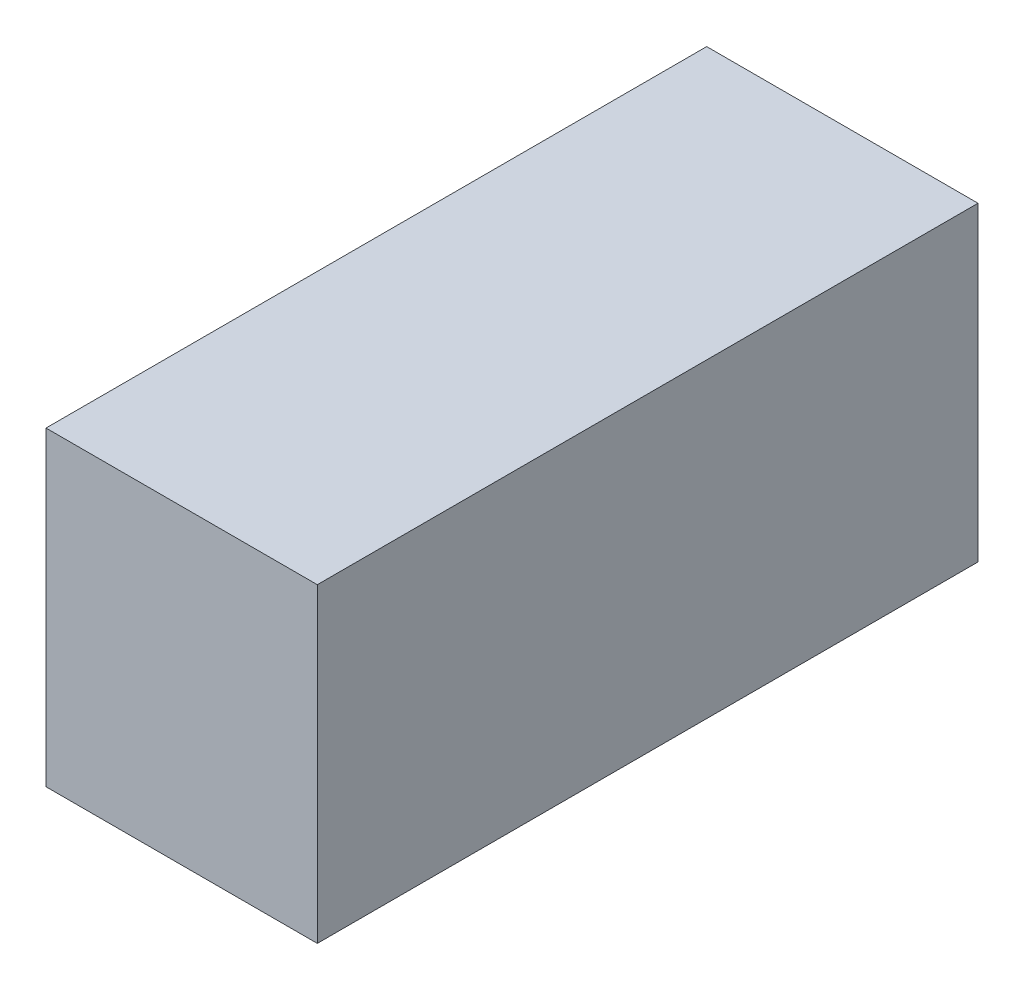
ISO-10303-21;
HEADER;
FILE_DESCRIPTION(('STEP AP214'),'2;1');
FILE_NAME('part.step','',(''),(''),'','','');
FILE_SCHEMA(('AUTOMOTIVE_DESIGN { 1 0 10303 214 1 1 1 1 }'));
ENDSEC;
DATA;
#1=APPLICATION_CONTEXT('core data for automotive mechanical design processes');
#2=APPLICATION_PROTOCOL_DEFINITION('international standard','automotive_design',2000,#1);
#3=PRODUCT_CONTEXT('',#1,'mechanical');
#4=PRODUCT('Part','Part','',(#3));
#5=PRODUCT_RELATED_PRODUCT_CATEGORY('part','',(#4));
#6=PRODUCT_DEFINITION_FORMATION('','',#4);
#7=PRODUCT_DEFINITION_CONTEXT('part definition',#1,'design');
#8=PRODUCT_DEFINITION('design','',#6,#7);
#9=PRODUCT_DEFINITION_SHAPE('','',#8);
#10=(LENGTH_UNIT() NAMED_UNIT(*) SI_UNIT(.MILLI.,.METRE.));
#11=(NAMED_UNIT(*) PLANE_ANGLE_UNIT() SI_UNIT($,.RADIAN.));
#12=(NAMED_UNIT(*) SI_UNIT($,.STERADIAN.) SOLID_ANGLE_UNIT());
#13=UNCERTAINTY_MEASURE_WITH_UNIT(LENGTH_MEASURE(1.E-05),#10,'distance_accuracy_value','');
#14=(GEOMETRIC_REPRESENTATION_CONTEXT(3) GLOBAL_UNCERTAINTY_ASSIGNED_CONTEXT((#13)) GLOBAL_UNIT_ASSIGNED_CONTEXT((#10,
#11,#12)) REPRESENTATION_CONTEXT('',''));
#15=CARTESIAN_POINT('',(0.,0.,0.));
#16=DIRECTION('',(0.,0.,1.));
#17=DIRECTION('',(1.,0.,0.));
#18=AXIS2_PLACEMENT_3D('',#15,#16,#17);
#19=CARTESIAN_POINT('',(-58.6052631578948,33.6118421052632,319.));
#20=DIRECTION('',(1.,0.,0.));
#21=DIRECTION('',(0.,1.,0.));
#22=AXIS2_PLACEMENT_3D('',#19,#20,#21);
#23=PLANE('',#22);
#24=DIRECTION('',(0.,-1.,0.));
#25=VECTOR('',#24,1.);
#26=CARTESIAN_POINT('',(-58.6052631578948,33.6118421052632,0.));
#27=LINE('',#26,#25);
#28=CARTESIAN_POINT('',(-58.6052631578948,33.6118421052632,0.));
#29=VERTEX_POINT('',#28);
#30=CARTESIAN_POINT('',(-58.6052631578947,-116.388157894737,0.));
#31=VERTEX_POINT('',#30);
#32=EDGE_CURVE('E107',#29,#31,#27,.T.);
#33=ORIENTED_EDGE('',*,*,#32,.T.);
#34=DIRECTION('',(0.,0.,-1.));
#35=VECTOR('',#34,1.);
#36=CARTESIAN_POINT('',(-58.6052631578947,-116.388157894737,319.));
#37=LINE('',#36,#35);
#38=CARTESIAN_POINT('',(-58.6052631578947,-116.388157894737,319.));
#39=VERTEX_POINT('',#38);
#40=EDGE_CURVE('E11',#39,#31,#37,.T.);
#41=ORIENTED_EDGE('',*,*,#40,.F.);
#42=DIRECTION('',(0.,-1.,0.));
#43=VECTOR('',#42,1.);
#44=CARTESIAN_POINT('',(-58.6052631578948,33.6118421052632,319.));
#45=LINE('',#44,#43);
#46=CARTESIAN_POINT('',(-58.6052631578948,33.6118421052632,319.));
#47=VERTEX_POINT('',#46);
#48=EDGE_CURVE('E91',#47,#39,#45,.T.);
#49=ORIENTED_EDGE('',*,*,#48,.F.);
#50=DIRECTION('',(0.,0.,-1.));
#51=VECTOR('',#50,1.);
#52=CARTESIAN_POINT('',(-58.6052631578948,33.6118421052632,319.));
#53=LINE('',#52,#51);
#54=EDGE_CURVE('E103',#47,#29,#53,.T.);
#55=ORIENTED_EDGE('',*,*,#54,.T.);
#56=EDGE_LOOP('',(#33,#41,#49,#55));
#57=FACE_BOUND('',#56,.T.);
#58=ADVANCED_FACE('F39',(#57),#23,.F.);
#59=CARTESIAN_POINT('',(-58.6052631578947,-116.388157894737,319.));
#60=DIRECTION('',(0.,1.,0.));
#61=DIRECTION('',(0.,0.,1.));
#62=AXIS2_PLACEMENT_3D('',#59,#60,#61);
#63=PLANE('',#62);
#64=DIRECTION('',(1.,0.,0.));
#65=VECTOR('',#64,1.);
#66=CARTESIAN_POINT('',(-58.6052631578947,-116.388157894737,0.));
#67=LINE('',#66,#65);
#68=CARTESIAN_POINT('',(72.3947368421053,-116.388157894737,0.));
#69=VERTEX_POINT('',#68);
#70=EDGE_CURVE('E96',#31,#69,#67,.T.);
#71=ORIENTED_EDGE('',*,*,#70,.T.);
#72=DIRECTION('',(0.,0.,-1.));
#73=VECTOR('',#72,1.);
#74=CARTESIAN_POINT('',(72.3947368421053,-116.388157894737,319.));
#75=LINE('',#74,#73);
#76=CARTESIAN_POINT('',(72.3947368421053,-116.388157894737,319.));
#77=VERTEX_POINT('',#76);
#78=EDGE_CURVE('E48',#77,#69,#75,.T.);
#79=ORIENTED_EDGE('',*,*,#78,.F.);
#80=DIRECTION('',(1.,0.,0.));
#81=VECTOR('',#80,1.);
#82=CARTESIAN_POINT('',(-58.6052631578947,-116.388157894737,319.));
#83=LINE('',#82,#81);
#84=EDGE_CURVE('E86',#39,#77,#83,.T.);
#85=ORIENTED_EDGE('',*,*,#84,.F.);
#86=ORIENTED_EDGE('',*,*,#40,.T.);
#87=EDGE_LOOP('',(#71,#79,#85,#86));
#88=FACE_BOUND('',#87,.T.);
#89=ADVANCED_FACE('F95',(#88),#63,.F.);
#90=CARTESIAN_POINT('',(72.3947368421053,33.6118421052632,319.));
#91=DIRECTION('',(-1.,0.,0.));
#92=DIRECTION('',(0.,-1.,0.));
#93=AXIS2_PLACEMENT_3D('',#90,#91,#92);
#94=PLANE('',#93);
#95=DIRECTION('',(0.,1.,0.));
#96=VECTOR('',#95,1.);
#97=CARTESIAN_POINT('',(72.3947368421053,33.6118421052632,0.));
#98=LINE('',#97,#96);
#99=CARTESIAN_POINT('',(72.3947368421053,33.6118421052632,0.));
#100=VERTEX_POINT('',#99);
#101=EDGE_CURVE('E73',#69,#100,#98,.T.);
#102=ORIENTED_EDGE('',*,*,#101,.T.);
#103=DIRECTION('',(0.,0.,-1.));
#104=VECTOR('',#103,1.);
#105=CARTESIAN_POINT('',(72.3947368421053,33.6118421052632,319.));
#106=LINE('',#105,#104);
#107=CARTESIAN_POINT('',(72.3947368421053,33.6118421052632,319.));
#108=VERTEX_POINT('',#107);
#109=EDGE_CURVE('E98',#108,#100,#106,.T.);
#110=ORIENTED_EDGE('',*,*,#109,.F.);
#111=DIRECTION('',(0.,1.,0.));
#112=VECTOR('',#111,1.);
#113=CARTESIAN_POINT('',(72.3947368421053,33.6118421052632,319.));
#114=LINE('',#113,#112);
#115=EDGE_CURVE('E89',#77,#108,#114,.T.);
#116=ORIENTED_EDGE('',*,*,#115,.F.);
#117=ORIENTED_EDGE('',*,*,#78,.T.);
#118=EDGE_LOOP('',(#102,#110,#116,#117));
#119=FACE_BOUND('',#118,.T.);
#120=ADVANCED_FACE('F99',(#119),#94,.F.);
#121=CARTESIAN_POINT('',(-58.6052631578948,33.6118421052632,319.));
#122=DIRECTION('',(0.,-1.,0.));
#123=DIRECTION('',(0.,0.,-1.));
#124=AXIS2_PLACEMENT_3D('',#121,#122,#123);
#125=PLANE('',#124);
#126=DIRECTION('',(-1.,0.,0.));
#127=VECTOR('',#126,1.);
#128=CARTESIAN_POINT('',(-58.6052631578948,33.6118421052632,0.));
#129=LINE('',#128,#127);
#130=EDGE_CURVE('E79',#100,#29,#129,.T.);
#131=ORIENTED_EDGE('',*,*,#130,.T.);
#132=ORIENTED_EDGE('',*,*,#54,.F.);
#133=DIRECTION('',(-1.,0.,0.));
#134=VECTOR('',#133,1.);
#135=CARTESIAN_POINT('',(-58.6052631578948,33.6118421052632,319.));
#136=LINE('',#135,#134);
#137=EDGE_CURVE('E56',#108,#47,#136,.T.);
#138=ORIENTED_EDGE('',*,*,#137,.F.);
#139=ORIENTED_EDGE('',*,*,#109,.T.);
#140=EDGE_LOOP('',(#131,#132,#138,#139));
#141=FACE_BOUND('',#140,.T.);
#142=ADVANCED_FACE('F120',(#141),#125,.F.);
#143=CARTESIAN_POINT('',(0.,0.,319.));
#144=DIRECTION('',(0.,0.,1.));
#145=DIRECTION('',(1.,0.,0.));
#146=AXIS2_PLACEMENT_3D('',#143,#144,#145);
#147=PLANE('',#146);
#148=ORIENTED_EDGE('',*,*,#48,.T.);
#149=ORIENTED_EDGE('',*,*,#84,.T.);
#150=ORIENTED_EDGE('',*,*,#115,.T.);
#151=ORIENTED_EDGE('',*,*,#137,.T.);
#152=EDGE_LOOP('',(#148,#149,#150,#151));
#153=FACE_BOUND('',#152,.T.);
#154=ADVANCED_FACE('F87',(#153),#147,.T.);
#155=CARTESIAN_POINT('',(0.,0.,0.));
#156=DIRECTION('',(0.,0.,1.));
#157=DIRECTION('',(1.,0.,0.));
#158=AXIS2_PLACEMENT_3D('',#155,#156,#157);
#159=PLANE('',#158);
#160=ORIENTED_EDGE('',*,*,#32,.F.);
#161=ORIENTED_EDGE('',*,*,#130,.F.);
#162=ORIENTED_EDGE('',*,*,#101,.F.);
#163=ORIENTED_EDGE('',*,*,#70,.F.);
#164=EDGE_LOOP('',(#160,#161,#162,#163));
#165=FACE_BOUND('',#164,.T.);
#166=ADVANCED_FACE('F123',(#165),#159,.F.);
#167=CLOSED_SHELL('',(#58,#89,#120,#142,#154,#166));
#168=MANIFOLD_SOLID_BREP('B2',#167);
#169=ADVANCED_BREP_SHAPE_REPRESENTATION('',(#18,#168),#14);
#170=SHAPE_DEFINITION_REPRESENTATION(#9,#169);
ENDSEC;
END-ISO-10303-21;
